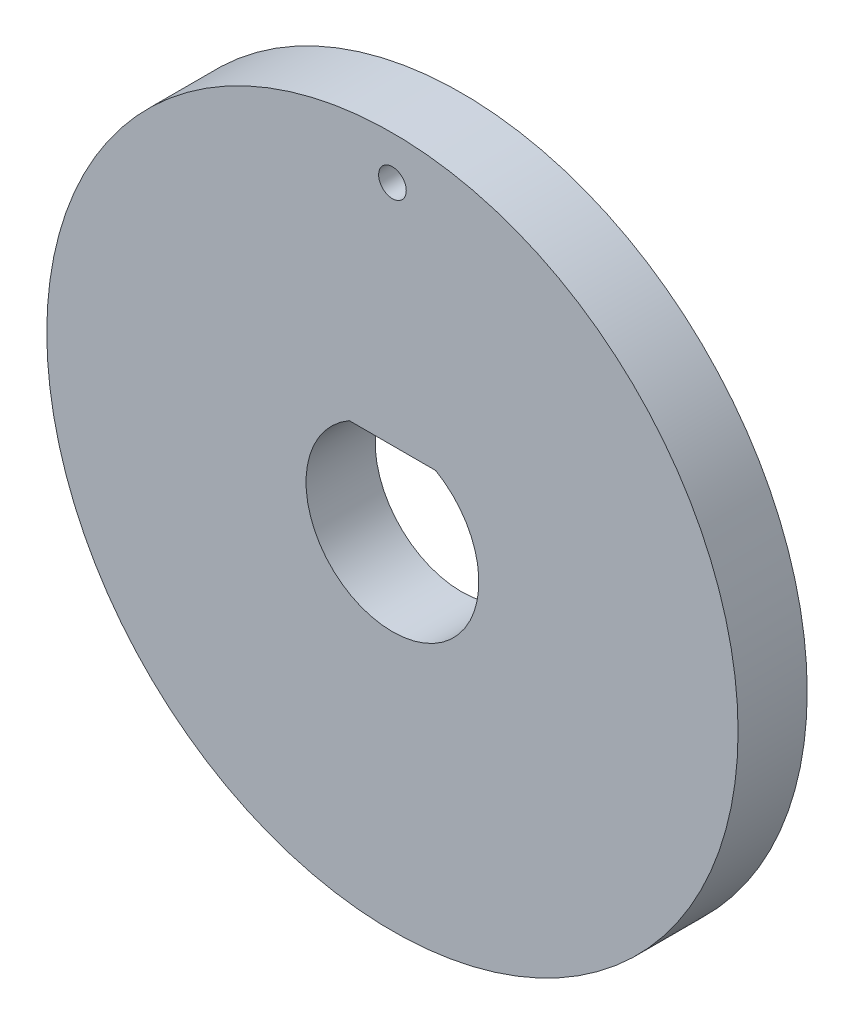
ISO-10303-21;
HEADER;
FILE_DESCRIPTION(('STEP AP214'),'2;1');
FILE_NAME('part.step','',(''),(''),'','','');
FILE_SCHEMA(('AUTOMOTIVE_DESIGN { 1 0 10303 214 1 1 1 1 }'));
ENDSEC;
DATA;
#1=APPLICATION_CONTEXT('core data for automotive mechanical design processes');
#2=APPLICATION_PROTOCOL_DEFINITION('international standard','automotive_design',2000,#1);
#3=PRODUCT_CONTEXT('',#1,'mechanical');
#4=PRODUCT('Part','Part','',(#3));
#5=PRODUCT_RELATED_PRODUCT_CATEGORY('part','',(#4));
#6=PRODUCT_DEFINITION_FORMATION('','',#4);
#7=PRODUCT_DEFINITION_CONTEXT('part definition',#1,'design');
#8=PRODUCT_DEFINITION('design','',#6,#7);
#9=PRODUCT_DEFINITION_SHAPE('','',#8);
#10=(LENGTH_UNIT() NAMED_UNIT(*) SI_UNIT(.MILLI.,.METRE.));
#11=(NAMED_UNIT(*) PLANE_ANGLE_UNIT() SI_UNIT($,.RADIAN.));
#12=(NAMED_UNIT(*) SI_UNIT($,.STERADIAN.) SOLID_ANGLE_UNIT());
#13=UNCERTAINTY_MEASURE_WITH_UNIT(LENGTH_MEASURE(1.E-05),#10,'distance_accuracy_value','');
#14=(GEOMETRIC_REPRESENTATION_CONTEXT(3) GLOBAL_UNCERTAINTY_ASSIGNED_CONTEXT((#13)) GLOBAL_UNIT_ASSIGNED_CONTEXT((#10,
#11,#12)) REPRESENTATION_CONTEXT('',''));
#15=CARTESIAN_POINT('',(0.,0.,0.));
#16=DIRECTION('',(0.,0.,1.));
#17=DIRECTION('',(1.,0.,0.));
#18=AXIS2_PLACEMENT_3D('',#15,#16,#17);
#19=CARTESIAN_POINT('',(0.,0.,2.54));
#20=DIRECTION('',(0.,0.,1.));
#21=DIRECTION('',(1.,0.,0.));
#22=AXIS2_PLACEMENT_3D('',#19,#20,#21);
#23=PLANE('',#22);
#24=DIRECTION('',(-1.,0.,0.));
#25=VECTOR('',#24,1.);
#26=CARTESIAN_POINT('',(-1.5875,2.74963065701559,2.54));
#27=LINE('',#26,#25);
#28=CARTESIAN_POINT('',(1.5875,2.74963065701559,2.54));
#29=VERTEX_POINT('',#28);
#30=CARTESIAN_POINT('',(-1.5875,2.74963065701559,2.54));
#31=VERTEX_POINT('',#30);
#32=EDGE_CURVE('E79',#29,#31,#27,.T.);
#33=ORIENTED_EDGE('',*,*,#32,.F.);
#34=CARTESIAN_POINT('',(0.,0.,2.54));
#35=DIRECTION('',(0.,0.,1.));
#36=DIRECTION('',(1.,0.,0.));
#37=AXIS2_PLACEMENT_3D('',#34,#35,#36);
#38=CIRCLE('',#37,3.175);
#39=EDGE_CURVE('E65',#31,#29,#38,.T.);
#40=ORIENTED_EDGE('',*,*,#39,.F.);
#41=EDGE_LOOP('',(#33,#40));
#42=FACE_BOUND('',#41,.T.);
#43=CARTESIAN_POINT('',(0.,0.,2.54));
#44=DIRECTION('',(0.,0.,1.));
#45=DIRECTION('',(1.,0.,0.));
#46=AXIS2_PLACEMENT_3D('',#43,#44,#45);
#47=CIRCLE('',#46,12.7);
#48=CARTESIAN_POINT('',(12.7,0.,2.54));
#49=VERTEX_POINT('',#48);
#50=EDGE_CURVE('E11',#49,#49,#47,.T.);
#51=ORIENTED_EDGE('',*,*,#50,.T.);
#52=EDGE_LOOP('',(#51));
#53=FACE_BOUND('',#52,.T.);
#54=CARTESIAN_POINT('',(0.,11.1125,2.54));
#55=DIRECTION('',(0.,0.,1.));
#56=DIRECTION('',(1.,0.,0.));
#57=AXIS2_PLACEMENT_3D('',#54,#55,#56);
#58=CIRCLE('',#57,0.507999999999999);
#59=CARTESIAN_POINT('',(0.507999999999999,11.1125,2.54));
#60=VERTEX_POINT('',#59);
#61=EDGE_CURVE('E73',#60,#60,#58,.T.);
#62=ORIENTED_EDGE('',*,*,#61,.F.);
#63=EDGE_LOOP('',(#62));
#64=FACE_BOUND('',#63,.T.);
#65=ADVANCED_FACE('F33',(#42,#53,#64),#23,.T.);
#66=CARTESIAN_POINT('',(0.,0.,0.));
#67=DIRECTION('',(0.,0.,1.));
#68=DIRECTION('',(1.,0.,0.));
#69=AXIS2_PLACEMENT_3D('',#66,#67,#68);
#70=PLANE('',#69);
#71=CARTESIAN_POINT('',(0.,0.,0.));
#72=DIRECTION('',(0.,0.,1.));
#73=DIRECTION('',(1.,0.,0.));
#74=AXIS2_PLACEMENT_3D('',#71,#72,#73);
#75=CIRCLE('',#74,3.175);
#76=CARTESIAN_POINT('',(-1.5875,2.74963065701559,0.));
#77=VERTEX_POINT('',#76);
#78=CARTESIAN_POINT('',(1.5875,2.74963065701559,0.));
#79=VERTEX_POINT('',#78);
#80=EDGE_CURVE('E55',#77,#79,#75,.T.);
#81=ORIENTED_EDGE('',*,*,#80,.T.);
#82=DIRECTION('',(-1.,0.,0.));
#83=VECTOR('',#82,1.);
#84=CARTESIAN_POINT('',(-1.5875,2.74963065701559,0.));
#85=LINE('',#84,#83);
#86=EDGE_CURVE('E61',#79,#77,#85,.T.);
#87=ORIENTED_EDGE('',*,*,#86,.T.);
#88=EDGE_LOOP('',(#81,#87));
#89=FACE_BOUND('',#88,.T.);
#90=CARTESIAN_POINT('',(0.,0.,0.));
#91=DIRECTION('',(0.,0.,1.));
#92=DIRECTION('',(1.,0.,0.));
#93=AXIS2_PLACEMENT_3D('',#90,#91,#92);
#94=CIRCLE('',#93,12.7);
#95=CARTESIAN_POINT('',(12.7,0.,0.));
#96=VERTEX_POINT('',#95);
#97=EDGE_CURVE('E37',#96,#96,#94,.T.);
#98=ORIENTED_EDGE('',*,*,#97,.F.);
#99=EDGE_LOOP('',(#98));
#100=FACE_BOUND('',#99,.T.);
#101=CARTESIAN_POINT('',(0.,11.1125,0.));
#102=DIRECTION('',(0.,0.,1.));
#103=DIRECTION('',(1.,0.,0.));
#104=AXIS2_PLACEMENT_3D('',#101,#102,#103);
#105=CIRCLE('',#104,0.507999999999999);
#106=CARTESIAN_POINT('',(0.507999999999999,11.1125,0.));
#107=VERTEX_POINT('',#106);
#108=EDGE_CURVE('E76',#107,#107,#105,.T.);
#109=ORIENTED_EDGE('',*,*,#108,.T.);
#110=EDGE_LOOP('',(#109));
#111=FACE_BOUND('',#110,.T.);
#112=ADVANCED_FACE('F71',(#89,#100,#111),#70,.F.);
#113=CARTESIAN_POINT('',(0.,0.,2.54));
#114=DIRECTION('',(0.,0.,-1.));
#115=DIRECTION('',(-1.,0.,0.));
#116=AXIS2_PLACEMENT_3D('',#113,#114,#115);
#117=CYLINDRICAL_SURFACE('',#116,12.7);
#118=ORIENTED_EDGE('',*,*,#50,.F.);
#119=EDGE_LOOP('',(#118));
#120=FACE_BOUND('',#119,.T.);
#121=ORIENTED_EDGE('',*,*,#97,.T.);
#122=EDGE_LOOP('',(#121));
#123=FACE_BOUND('',#122,.T.);
#124=ADVANCED_FACE('F35',(#120,#123),#117,.T.);
#125=CARTESIAN_POINT('',(0.,0.,2.54));
#126=DIRECTION('',(0.,0.,-1.));
#127=DIRECTION('',(-1.,0.,0.));
#128=AXIS2_PLACEMENT_3D('',#125,#126,#127);
#129=CYLINDRICAL_SURFACE('',#128,3.175);
#130=ORIENTED_EDGE('',*,*,#80,.F.);
#131=DIRECTION('',(0.,0.,-1.));
#132=VECTOR('',#131,1.);
#133=CARTESIAN_POINT('',(-1.5875,2.74963065701559,2.54));
#134=LINE('',#133,#132);
#135=EDGE_CURVE('E63',#31,#77,#134,.T.);
#136=ORIENTED_EDGE('',*,*,#135,.F.);
#137=ORIENTED_EDGE('',*,*,#39,.T.);
#138=DIRECTION('',(0.,0.,-1.));
#139=VECTOR('',#138,1.);
#140=CARTESIAN_POINT('',(1.5875,2.74963065701559,2.54));
#141=LINE('',#140,#139);
#142=EDGE_CURVE('E48',#29,#79,#141,.T.);
#143=ORIENTED_EDGE('',*,*,#142,.T.);
#144=EDGE_LOOP('',(#130,#136,#137,#143));
#145=FACE_BOUND('',#144,.T.);
#146=ADVANCED_FACE('F67',(#145),#129,.F.);
#147=CARTESIAN_POINT('',(-1.5875,2.74963065701559,2.54));
#148=DIRECTION('',(0.,-1.,0.));
#149=DIRECTION('',(0.,0.,-1.));
#150=AXIS2_PLACEMENT_3D('',#147,#148,#149);
#151=PLANE('',#150);
#152=ORIENTED_EDGE('',*,*,#86,.F.);
#153=ORIENTED_EDGE('',*,*,#142,.F.);
#154=ORIENTED_EDGE('',*,*,#32,.T.);
#155=ORIENTED_EDGE('',*,*,#135,.T.);
#156=EDGE_LOOP('',(#152,#153,#154,#155));
#157=FACE_BOUND('',#156,.T.);
#158=ADVANCED_FACE('F62',(#157),#151,.T.);
#159=CARTESIAN_POINT('',(0.,11.1125,2.54));
#160=DIRECTION('',(0.,0.,-1.));
#161=DIRECTION('',(-1.,0.,0.));
#162=AXIS2_PLACEMENT_3D('',#159,#160,#161);
#163=CYLINDRICAL_SURFACE('',#162,0.507999999999999);
#164=ORIENTED_EDGE('',*,*,#61,.T.);
#165=EDGE_LOOP('',(#164));
#166=FACE_BOUND('',#165,.T.);
#167=ORIENTED_EDGE('',*,*,#108,.F.);
#168=EDGE_LOOP('',(#167));
#169=FACE_BOUND('',#168,.T.);
#170=ADVANCED_FACE('F87',(#166,#169),#163,.F.);
#171=CLOSED_SHELL('',(#65,#112,#124,#146,#158,#170));
#172=MANIFOLD_SOLID_BREP('B2',#171);
#173=ADVANCED_BREP_SHAPE_REPRESENTATION('',(#18,#172),#14);
#174=SHAPE_DEFINITION_REPRESENTATION(#9,#173);
ENDSEC;
END-ISO-10303-21;
